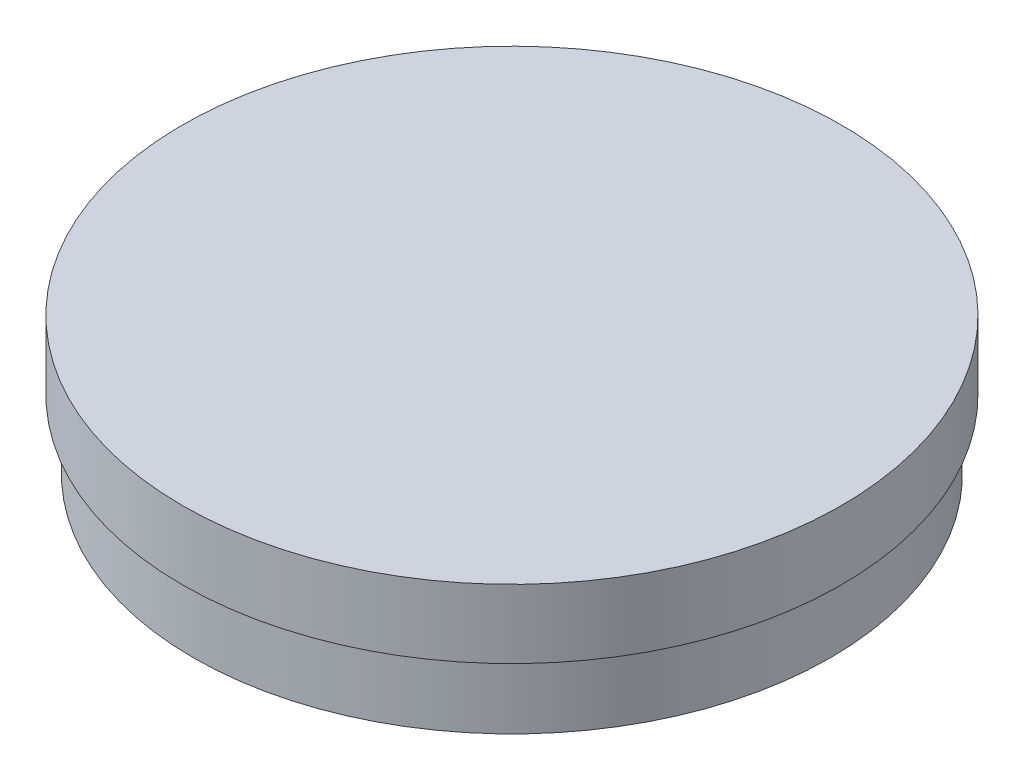
ISO-10303-21;
HEADER;
FILE_DESCRIPTION(('STEP AP214'),'2;1');
FILE_NAME('part.step','',(''),(''),'','','');
FILE_SCHEMA(('AUTOMOTIVE_DESIGN { 1 0 10303 214 1 1 1 1 }'));
ENDSEC;
DATA;
#1=APPLICATION_CONTEXT('core data for automotive mechanical design processes');
#2=APPLICATION_PROTOCOL_DEFINITION('international standard','automotive_design',2000,#1);
#3=PRODUCT_CONTEXT('',#1,'mechanical');
#4=PRODUCT('Part','Part','',(#3));
#5=PRODUCT_RELATED_PRODUCT_CATEGORY('part','',(#4));
#6=PRODUCT_DEFINITION_FORMATION('','',#4);
#7=PRODUCT_DEFINITION_CONTEXT('part definition',#1,'design');
#8=PRODUCT_DEFINITION('design','',#6,#7);
#9=PRODUCT_DEFINITION_SHAPE('','',#8);
#10=(LENGTH_UNIT() NAMED_UNIT(*) SI_UNIT(.MILLI.,.METRE.));
#11=(NAMED_UNIT(*) PLANE_ANGLE_UNIT() SI_UNIT($,.RADIAN.));
#12=(NAMED_UNIT(*) SI_UNIT($,.STERADIAN.) SOLID_ANGLE_UNIT());
#13=UNCERTAINTY_MEASURE_WITH_UNIT(LENGTH_MEASURE(1.E-05),#10,'distance_accuracy_value','');
#14=(GEOMETRIC_REPRESENTATION_CONTEXT(3) GLOBAL_UNCERTAINTY_ASSIGNED_CONTEXT((#13)) GLOBAL_UNIT_ASSIGNED_CONTEXT((#10,
#11,#12)) REPRESENTATION_CONTEXT('',''));
#15=CARTESIAN_POINT('',(0.,0.,0.));
#16=DIRECTION('',(0.,0.,1.));
#17=DIRECTION('',(1.,0.,0.));
#18=AXIS2_PLACEMENT_3D('',#15,#16,#17);
#19=CARTESIAN_POINT('',(0.,48.0535714285714,0.));
#20=DIRECTION('',(0.,-1.,0.));
#21=DIRECTION('',(0.,0.,-1.));
#22=AXIS2_PLACEMENT_3D('',#19,#20,#21);
#23=PLANE('',#22);
#24=CARTESIAN_POINT('',(0.,48.0535714285714,0.));
#25=DIRECTION('',(0.,1.,0.));
#26=DIRECTION('',(0.,0.,1.));
#27=AXIS2_PLACEMENT_3D('',#24,#25,#26);
#28=CIRCLE('',#27,120.);
#29=CARTESIAN_POINT('',(0.,48.0535714285714,120.));
#30=VERTEX_POINT('',#29);
#31=EDGE_CURVE('E10',#30,#30,#28,.T.);
#32=ORIENTED_EDGE('',*,*,#31,.T.);
#33=EDGE_LOOP('',(#32));
#34=FACE_BOUND('',#33,.T.);
#35=ADVANCED_FACE('F37',(#34),#23,.F.);
#36=CARTESIAN_POINT('',(0.,53.1607142857143,0.));
#37=DIRECTION('',(0.,1.,0.));
#38=DIRECTION('',(0.,0.,1.));
#39=AXIS2_PLACEMENT_3D('',#36,#37,#38);
#40=CYLINDRICAL_SURFACE('',#39,120.);
#41=ORIENTED_EDGE('',*,*,#31,.F.);
#42=EDGE_LOOP('',(#41));
#43=FACE_BOUND('',#42,.T.);
#44=CARTESIAN_POINT('',(0.,23.0535714285714,0.));
#45=DIRECTION('',(0.,1.,0.));
#46=DIRECTION('',(0.,0.,1.));
#47=AXIS2_PLACEMENT_3D('',#44,#45,#46);
#48=CIRCLE('',#47,120.);
#49=CARTESIAN_POINT('',(0.,23.0535714285714,120.));
#50=VERTEX_POINT('',#49);
#51=EDGE_CURVE('E44',#50,#50,#48,.T.);
#52=ORIENTED_EDGE('',*,*,#51,.T.);
#53=EDGE_LOOP('',(#52));
#54=FACE_BOUND('',#53,.T.);
#55=ADVANCED_FACE('F73',(#43,#54),#40,.T.);
#56=CARTESIAN_POINT('',(120.,23.0535714285714,0.));
#57=DIRECTION('',(0.,1.,0.));
#58=DIRECTION('',(0.,0.,1.));
#59=AXIS2_PLACEMENT_3D('',#56,#57,#58);
#60=PLANE('',#59);
#61=ORIENTED_EDGE('',*,*,#51,.F.);
#62=EDGE_LOOP('',(#61));
#63=FACE_BOUND('',#62,.T.);
#64=CARTESIAN_POINT('',(0.,23.0535714285714,0.));
#65=DIRECTION('',(0.,1.,0.));
#66=DIRECTION('',(0.,0.,1.));
#67=AXIS2_PLACEMENT_3D('',#64,#65,#66);
#68=CIRCLE('',#67,116.);
#69=CARTESIAN_POINT('',(0.,23.0535714285714,116.));
#70=VERTEX_POINT('',#69);
#71=EDGE_CURVE('E49',#70,#70,#68,.T.);
#72=ORIENTED_EDGE('',*,*,#71,.T.);
#73=EDGE_LOOP('',(#72));
#74=FACE_BOUND('',#73,.T.);
#75=ADVANCED_FACE('F69',(#63,#74),#60,.F.);
#76=CARTESIAN_POINT('',(0.,53.1607142857143,0.));
#77=DIRECTION('',(0.,1.,0.));
#78=DIRECTION('',(0.,0.,1.));
#79=AXIS2_PLACEMENT_3D('',#76,#77,#78);
#80=CYLINDRICAL_SURFACE('',#79,116.);
#81=ORIENTED_EDGE('',*,*,#71,.F.);
#82=EDGE_LOOP('',(#81));
#83=FACE_BOUND('',#82,.T.);
#84=CARTESIAN_POINT('',(0.,-1.94642857142858,0.));
#85=DIRECTION('',(0.,1.,0.));
#86=DIRECTION('',(0.,0.,1.));
#87=AXIS2_PLACEMENT_3D('',#84,#85,#86);
#88=CIRCLE('',#87,116.);
#89=CARTESIAN_POINT('',(0.,-1.94642857142858,116.));
#90=VERTEX_POINT('',#89);
#91=EDGE_CURVE('E54',#90,#90,#88,.T.);
#92=ORIENTED_EDGE('',*,*,#91,.T.);
#93=EDGE_LOOP('',(#92));
#94=FACE_BOUND('',#93,.T.);
#95=ADVANCED_FACE('F61',(#83,#94),#80,.T.);
#96=CARTESIAN_POINT('',(116.,-1.94642857142858,0.));
#97=DIRECTION('',(0.,1.,0.));
#98=DIRECTION('',(0.,0.,1.));
#99=AXIS2_PLACEMENT_3D('',#96,#97,#98);
#100=PLANE('',#99);
#101=ORIENTED_EDGE('',*,*,#91,.F.);
#102=EDGE_LOOP('',(#101));
#103=FACE_BOUND('',#102,.T.);
#104=ADVANCED_FACE('F63',(#103),#100,.F.);
#105=CLOSED_SHELL('',(#35,#55,#75,#95,#104));
#106=MANIFOLD_SOLID_BREP('B2',#105);
#107=ADVANCED_BREP_SHAPE_REPRESENTATION('',(#18,#106),#14);
#108=SHAPE_DEFINITION_REPRESENTATION(#9,#107);
ENDSEC;
END-ISO-10303-21;
